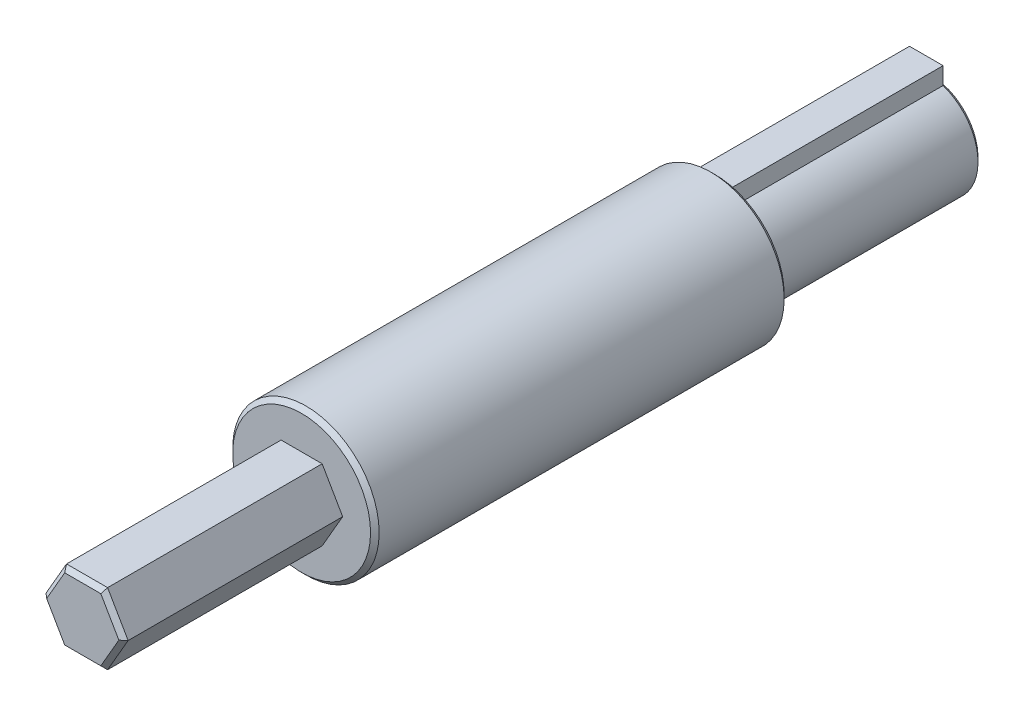
ISO-10303-21;
HEADER;
FILE_DESCRIPTION(('STEP AP214'),'2;1');
FILE_NAME('part.step','',(''),(''),'','','');
FILE_SCHEMA(('AUTOMOTIVE_DESIGN { 1 0 10303 214 1 1 1 1 }'));
ENDSEC;
DATA;
#1=APPLICATION_CONTEXT('core data for automotive mechanical design processes');
#2=APPLICATION_PROTOCOL_DEFINITION('international standard','automotive_design',2000,#1);
#3=PRODUCT_CONTEXT('',#1,'mechanical');
#4=PRODUCT('Part','Part','',(#3));
#5=PRODUCT_RELATED_PRODUCT_CATEGORY('part','',(#4));
#6=PRODUCT_DEFINITION_FORMATION('','',#4);
#7=PRODUCT_DEFINITION_CONTEXT('part definition',#1,'design');
#8=PRODUCT_DEFINITION('design','',#6,#7);
#9=PRODUCT_DEFINITION_SHAPE('','',#8);
#10=(LENGTH_UNIT() NAMED_UNIT(*) SI_UNIT(.MILLI.,.METRE.));
#11=(NAMED_UNIT(*) PLANE_ANGLE_UNIT() SI_UNIT($,.RADIAN.));
#12=(NAMED_UNIT(*) SI_UNIT($,.STERADIAN.) SOLID_ANGLE_UNIT());
#13=UNCERTAINTY_MEASURE_WITH_UNIT(LENGTH_MEASURE(1.E-05),#10,'distance_accuracy_value','');
#14=(GEOMETRIC_REPRESENTATION_CONTEXT(3) GLOBAL_UNCERTAINTY_ASSIGNED_CONTEXT((#13)) GLOBAL_UNIT_ASSIGNED_CONTEXT((#10,
#11,#12)) REPRESENTATION_CONTEXT('',''));
#15=CARTESIAN_POINT('',(0.,0.,0.));
#16=DIRECTION('',(0.,0.,1.));
#17=DIRECTION('',(1.,0.,0.));
#18=AXIS2_PLACEMENT_3D('',#15,#16,#17);
#19=CARTESIAN_POINT('',(0.,0.,0.));
#20=DIRECTION('',(0.,0.,1.));
#21=DIRECTION('',(1.,0.,0.));
#22=AXIS2_PLACEMENT_3D('',#19,#20,#21);
#23=PLANE('',#22);
#24=CARTESIAN_POINT('',(0.,0.,0.));
#25=DIRECTION('',(0.,0.,1.));
#26=DIRECTION('',(1.,0.,0.));
#27=AXIS2_PLACEMENT_3D('',#24,#25,#26);
#28=CIRCLE('',#27,7.99999999999998);
#29=CARTESIAN_POINT('',(7.99999999999998,0.,0.));
#30=VERTEX_POINT('',#29);
#31=EDGE_CURVE('E11',#30,#30,#28,.F.);
#32=ORIENTED_EDGE('',*,*,#31,.T.);
#33=EDGE_LOOP('',(#32));
#34=FACE_BOUND('',#33,.T.);
#35=DIRECTION('',(0.,1.,0.));
#36=VECTOR('',#35,1.);
#37=CARTESIAN_POINT('',(-1.95,7.67428409581332,0.));
#38=LINE('',#37,#36);
#39=CARTESIAN_POINT('',(-1.95,5.67428409581332,0.));
#40=VERTEX_POINT('',#39);
#41=CARTESIAN_POINT('',(-1.95,7.67428409581332,0.));
#42=VERTEX_POINT('',#41);
#43=EDGE_CURVE('E215',#40,#42,#38,.T.);
#44=ORIENTED_EDGE('',*,*,#43,.F.);
#45=CARTESIAN_POINT('',(0.,0.,0.));
#46=DIRECTION('',(0.,0.,1.));
#47=DIRECTION('',(1.,0.,0.));
#48=AXIS2_PLACEMENT_3D('',#45,#46,#47);
#49=CIRCLE('',#48,6.);
#50=CARTESIAN_POINT('',(1.95,5.67428409581332,0.));
#51=VERTEX_POINT('',#50);
#52=EDGE_CURVE('E211',#40,#51,#49,.T.);
#53=ORIENTED_EDGE('',*,*,#52,.T.);
#54=DIRECTION('',(0.,-1.,0.));
#55=VECTOR('',#54,1.);
#56=CARTESIAN_POINT('',(1.95,5.67428409581332,0.));
#57=LINE('',#56,#55);
#58=CARTESIAN_POINT('',(1.95,7.67428409581332,0.));
#59=VERTEX_POINT('',#58);
#60=EDGE_CURVE('E223',#59,#51,#57,.T.);
#61=ORIENTED_EDGE('',*,*,#60,.F.);
#62=DIRECTION('',(1.,0.,0.));
#63=VECTOR('',#62,1.);
#64=CARTESIAN_POINT('',(1.95,7.67428409581332,0.));
#65=LINE('',#64,#63);
#66=EDGE_CURVE('E219',#42,#59,#65,.T.);
#67=ORIENTED_EDGE('',*,*,#66,.F.);
#68=EDGE_LOOP('',(#44,#53,#61,#67));
#69=FACE_BOUND('',#68,.T.);
#70=ADVANCED_FACE('F41',(#34,#69),#23,.F.);
#71=CARTESIAN_POINT('',(0.,0.,48.));
#72=DIRECTION('',(0.,0.,-1.));
#73=DIRECTION('',(-1.,0.,0.));
#74=AXIS2_PLACEMENT_3D('',#71,#72,#73);
#75=CYLINDRICAL_SURFACE('',#74,8.5);
#76=CARTESIAN_POINT('',(0.,0.,47.5));
#77=DIRECTION('',(0.,0.,1.));
#78=DIRECTION('',(1.,0.,0.));
#79=AXIS2_PLACEMENT_3D('',#76,#77,#78);
#80=CIRCLE('',#79,8.5);
#81=CARTESIAN_POINT('',(8.5,0.,47.5));
#82=VERTEX_POINT('',#81);
#83=EDGE_CURVE('E52',#82,#82,#80,.F.);
#84=ORIENTED_EDGE('',*,*,#83,.T.);
#85=EDGE_LOOP('',(#84));
#86=FACE_BOUND('',#85,.T.);
#87=CARTESIAN_POINT('',(0.,0.,0.500000000000035));
#88=DIRECTION('',(0.,0.,1.));
#89=DIRECTION('',(1.,0.,0.));
#90=AXIS2_PLACEMENT_3D('',#87,#88,#89);
#91=CIRCLE('',#90,8.5);
#92=CARTESIAN_POINT('',(8.5,0.,0.500000000000035));
#93=VERTEX_POINT('',#92);
#94=EDGE_CURVE('E304',#93,#93,#91,.T.);
#95=ORIENTED_EDGE('',*,*,#94,.T.);
#96=EDGE_LOOP('',(#95));
#97=FACE_BOUND('',#96,.T.);
#98=ADVANCED_FACE('F409',(#86,#97),#75,.T.);
#99=CARTESIAN_POINT('',(0.,0.,48.));
#100=DIRECTION('',(0.,0.,1.));
#101=DIRECTION('',(1.,0.,0.));
#102=AXIS2_PLACEMENT_3D('',#99,#100,#101);
#103=PLANE('',#102);
#104=CARTESIAN_POINT('',(0.,0.,48.));
#105=DIRECTION('',(0.,0.,1.));
#106=DIRECTION('',(1.,0.,0.));
#107=AXIS2_PLACEMENT_3D('',#104,#105,#106);
#108=CIRCLE('',#107,7.99999999999999);
#109=CARTESIAN_POINT('',(7.99999999999999,0.,48.));
#110=VERTEX_POINT('',#109);
#111=EDGE_CURVE('E300',#110,#110,#108,.T.);
#112=ORIENTED_EDGE('',*,*,#111,.T.);
#113=EDGE_LOOP('',(#112));
#114=FACE_BOUND('',#113,.T.);
#115=DIRECTION('',(0.5,0.866025403784439,0.));
#116=VECTOR('',#115,1.);
#117=CARTESIAN_POINT('',(2.38301323608018,-4.1275,48.));
#118=LINE('',#117,#116);
#119=CARTESIAN_POINT('',(2.38301323608018,-4.1275,48.));
#120=VERTEX_POINT('',#119);
#121=CARTESIAN_POINT('',(4.76602647216036,0.,48.));
#122=VERTEX_POINT('',#121);
#123=EDGE_CURVE('E182',#120,#122,#118,.T.);
#124=ORIENTED_EDGE('',*,*,#123,.F.);
#125=DIRECTION('',(1.,0.,0.));
#126=VECTOR('',#125,1.);
#127=CARTESIAN_POINT('',(-2.38301323608018,-4.1275,48.));
#128=LINE('',#127,#126);
#129=CARTESIAN_POINT('',(-2.38301323608018,-4.1275,48.));
#130=VERTEX_POINT('',#129);
#131=EDGE_CURVE('E194',#130,#120,#128,.T.);
#132=ORIENTED_EDGE('',*,*,#131,.F.);
#133=DIRECTION('',(0.5,-0.866025403784439,0.));
#134=VECTOR('',#133,1.);
#135=CARTESIAN_POINT('',(-4.76602647216036,0.,48.));
#136=LINE('',#135,#134);
#137=CARTESIAN_POINT('',(-4.76602647216036,0.,48.));
#138=VERTEX_POINT('',#137);
#139=EDGE_CURVE('E190',#138,#130,#136,.T.);
#140=ORIENTED_EDGE('',*,*,#139,.F.);
#141=DIRECTION('',(-0.5,-0.866025403784439,0.));
#142=VECTOR('',#141,1.);
#143=CARTESIAN_POINT('',(-2.38301323608018,4.1275,48.));
#144=LINE('',#143,#142);
#145=CARTESIAN_POINT('',(-2.38301323608018,4.1275,48.));
#146=VERTEX_POINT('',#145);
#147=EDGE_CURVE('E176',#146,#138,#144,.T.);
#148=ORIENTED_EDGE('',*,*,#147,.F.);
#149=DIRECTION('',(-1.,0.,0.));
#150=VECTOR('',#149,1.);
#151=CARTESIAN_POINT('',(2.38301323608018,4.1275,48.));
#152=LINE('',#151,#150);
#153=CARTESIAN_POINT('',(2.38301323608018,4.1275,48.));
#154=VERTEX_POINT('',#153);
#155=EDGE_CURVE('E157',#154,#146,#152,.T.);
#156=ORIENTED_EDGE('',*,*,#155,.F.);
#157=DIRECTION('',(-0.5,0.866025403784438,0.));
#158=VECTOR('',#157,1.);
#159=CARTESIAN_POINT('',(4.76602647216036,0.,48.));
#160=LINE('',#159,#158);
#161=EDGE_CURVE('E172',#122,#154,#160,.T.);
#162=ORIENTED_EDGE('',*,*,#161,.F.);
#163=EDGE_LOOP('',(#124,#132,#140,#148,#156,#162));
#164=FACE_BOUND('',#163,.T.);
#165=ADVANCED_FACE('F171',(#114,#164),#103,.T.);
#166=CARTESIAN_POINT('',(0.,0.,25.4));
#167=DIRECTION('',(0.,0.,-1.));
#168=DIRECTION('',(-1.,0.,0.));
#169=AXIS2_PLACEMENT_3D('',#166,#167,#168);
#170=CYLINDRICAL_SURFACE('',#169,6.);
#171=DIRECTION('',(0.,0.,1.));
#172=VECTOR('',#171,1.);
#173=CARTESIAN_POINT('',(-1.95,5.67428409581332,-25.));
#174=LINE('',#173,#172);
#175=CARTESIAN_POINT('',(-1.95,5.67428409581332,-24.5));
#176=VERTEX_POINT('',#175);
#177=EDGE_CURVE('E236',#176,#40,#174,.T.);
#178=ORIENTED_EDGE('',*,*,#177,.F.);
#179=CARTESIAN_POINT('',(0.,0.,-24.5));
#180=DIRECTION('',(0.,0.,-1.));
#181=DIRECTION('',(-1.,0.,0.));
#182=AXIS2_PLACEMENT_3D('',#179,#180,#181);
#183=CIRCLE('',#182,6.);
#184=CARTESIAN_POINT('',(1.95,5.67428409581332,-24.5));
#185=VERTEX_POINT('',#184);
#186=EDGE_CURVE('E297',#176,#185,#183,.F.);
#187=ORIENTED_EDGE('',*,*,#186,.T.);
#188=DIRECTION('',(0.,0.,1.));
#189=VECTOR('',#188,1.);
#190=CARTESIAN_POINT('',(1.95,5.67428409581332,-25.));
#191=LINE('',#190,#189);
#192=EDGE_CURVE('E227',#185,#51,#191,.T.);
#193=ORIENTED_EDGE('',*,*,#192,.T.);
#194=ORIENTED_EDGE('',*,*,#52,.F.);
#195=EDGE_LOOP('',(#178,#187,#193,#194));
#196=FACE_BOUND('',#195,.T.);
#197=ADVANCED_FACE('F392',(#196),#170,.T.);
#198=CARTESIAN_POINT('',(-1.95,7.67428409581332,-25.));
#199=DIRECTION('',(1.,0.,0.));
#200=DIRECTION('',(0.,0.,-1.));
#201=AXIS2_PLACEMENT_3D('',#198,#199,#200);
#202=PLANE('',#201);
#203=DIRECTION('',(0.,0.,1.));
#204=VECTOR('',#203,1.);
#205=CARTESIAN_POINT('',(-1.95,7.67428409581332,-25.));
#206=LINE('',#205,#204);
#207=CARTESIAN_POINT('',(-1.95,7.67428409581332,-24.5));
#208=VERTEX_POINT('',#207);
#209=EDGE_CURVE('E233',#208,#42,#206,.T.);
#210=ORIENTED_EDGE('',*,*,#209,.F.);
#211=DIRECTION('',(0.,-1.,0.));
#212=VECTOR('',#211,1.);
#213=CARTESIAN_POINT('',(-1.95,5.67428409581332,-24.5));
#214=LINE('',#213,#212);
#215=EDGE_CURVE('E60',#208,#176,#214,.T.);
#216=ORIENTED_EDGE('',*,*,#215,.T.);
#217=ORIENTED_EDGE('',*,*,#177,.T.);
#218=ORIENTED_EDGE('',*,*,#43,.T.);
#219=EDGE_LOOP('',(#210,#216,#217,#218));
#220=FACE_BOUND('',#219,.T.);
#221=ADVANCED_FACE('F390',(#220),#202,.F.);
#222=CARTESIAN_POINT('',(1.95,7.67428409581332,-25.));
#223=DIRECTION('',(0.,-1.,0.));
#224=DIRECTION('',(0.,0.,-1.));
#225=AXIS2_PLACEMENT_3D('',#222,#223,#224);
#226=PLANE('',#225);
#227=DIRECTION('',(0.,0.,1.));
#228=VECTOR('',#227,1.);
#229=CARTESIAN_POINT('',(1.95,7.67428409581332,-25.));
#230=LINE('',#229,#228);
#231=CARTESIAN_POINT('',(1.95,7.67428409581332,-24.5));
#232=VERTEX_POINT('',#231);
#233=EDGE_CURVE('E230',#232,#59,#230,.T.);
#234=ORIENTED_EDGE('',*,*,#233,.F.);
#235=DIRECTION('',(-1.,0.,0.));
#236=VECTOR('',#235,1.);
#237=CARTESIAN_POINT('',(-1.95,7.67428409581332,-24.5));
#238=LINE('',#237,#236);
#239=EDGE_CURVE('E68',#232,#208,#238,.T.);
#240=ORIENTED_EDGE('',*,*,#239,.T.);
#241=ORIENTED_EDGE('',*,*,#209,.T.);
#242=ORIENTED_EDGE('',*,*,#66,.T.);
#243=EDGE_LOOP('',(#234,#240,#241,#242));
#244=FACE_BOUND('',#243,.T.);
#245=ADVANCED_FACE('F385',(#244),#226,.F.);
#246=CARTESIAN_POINT('',(1.95,5.67428409581332,-25.));
#247=DIRECTION('',(-1.,0.,0.));
#248=DIRECTION('',(0.,0.,1.));
#249=AXIS2_PLACEMENT_3D('',#246,#247,#248);
#250=PLANE('',#249);
#251=ORIENTED_EDGE('',*,*,#192,.F.);
#252=DIRECTION('',(0.,1.,0.));
#253=VECTOR('',#252,1.);
#254=CARTESIAN_POINT('',(1.95,7.67428409581332,-24.5));
#255=LINE('',#254,#253);
#256=EDGE_CURVE('E289',#185,#232,#255,.T.);
#257=ORIENTED_EDGE('',*,*,#256,.T.);
#258=ORIENTED_EDGE('',*,*,#233,.T.);
#259=ORIENTED_EDGE('',*,*,#60,.T.);
#260=EDGE_LOOP('',(#251,#257,#258,#259));
#261=FACE_BOUND('',#260,.T.);
#262=ADVANCED_FACE('F383',(#261),#250,.F.);
#263=CARTESIAN_POINT('',(0.,0.,-25.));
#264=DIRECTION('',(0.,0.,-1.));
#265=DIRECTION('',(-1.,0.,0.));
#266=AXIS2_PLACEMENT_3D('',#263,#264,#265);
#267=PLANE('',#266);
#268=DIRECTION('',(1.,0.,0.));
#269=VECTOR('',#268,1.);
#270=CARTESIAN_POINT('',(1.95,7.17428409581331,-25.));
#271=LINE('',#270,#269);
#272=CARTESIAN_POINT('',(-1.44999999999999,7.17428409581331,-25.));
#273=VERTEX_POINT('',#272);
#274=CARTESIAN_POINT('',(1.44999999999999,7.17428409581331,-25.));
#275=VERTEX_POINT('',#274);
#276=EDGE_CURVE('E282',#273,#275,#271,.T.);
#277=ORIENTED_EDGE('',*,*,#276,.T.);
#278=DIRECTION('',(0.,-1.,0.));
#279=VECTOR('',#278,1.);
#280=CARTESIAN_POINT('',(1.44999999999999,5.67428409581332,-25.));
#281=LINE('',#280,#279);
#282=CARTESIAN_POINT('',(1.44999999999999,5.30542175514821,-25.));
#283=VERTEX_POINT('',#282);
#284=EDGE_CURVE('E285',#275,#283,#281,.T.);
#285=ORIENTED_EDGE('',*,*,#284,.T.);
#286=CARTESIAN_POINT('',(0.,0.,-25.));
#287=DIRECTION('',(0.,0.,-1.));
#288=DIRECTION('',(-1.,0.,0.));
#289=AXIS2_PLACEMENT_3D('',#286,#287,#288);
#290=CIRCLE('',#289,5.49999999999999);
#291=CARTESIAN_POINT('',(-1.44999999999999,5.30542175514821,-25.));
#292=VERTEX_POINT('',#291);
#293=EDGE_CURVE('E276',#283,#292,#290,.T.);
#294=ORIENTED_EDGE('',*,*,#293,.T.);
#295=DIRECTION('',(0.,1.,0.));
#296=VECTOR('',#295,1.);
#297=CARTESIAN_POINT('',(-1.44999999999999,7.67428409581332,-25.));
#298=LINE('',#297,#296);
#299=EDGE_CURVE('E279',#292,#273,#298,.T.);
#300=ORIENTED_EDGE('',*,*,#299,.T.);
#301=EDGE_LOOP('',(#277,#285,#294,#300));
#302=FACE_BOUND('',#301,.T.);
#303=ADVANCED_FACE('F396',(#302),#267,.T.);
#304=CARTESIAN_POINT('',(2.38301323608018,-4.1275,73.4));
#305=DIRECTION('',(-0.866025403784439,0.5,0.));
#306=DIRECTION('',(-0.5,-0.866025403784439,0.));
#307=AXIS2_PLACEMENT_3D('',#304,#305,#306);
#308=PLANE('',#307);
#309=DIRECTION('',(0.,0.,-1.));
#310=VECTOR('',#309,1.);
#311=CARTESIAN_POINT('',(4.76602647216036,0.,73.4));
#312=LINE('',#311,#310);
#313=CARTESIAN_POINT('',(4.76602647216036,0.,72.9));
#314=VERTEX_POINT('',#313);
#315=EDGE_CURVE('E164',#314,#122,#312,.T.);
#316=ORIENTED_EDGE('',*,*,#315,.F.);
#317=DIRECTION('',(-0.5,-0.866025403784439,0.));
#318=VECTOR('',#317,1.);
#319=CARTESIAN_POINT('',(2.38301323608018,-4.1275,72.9));
#320=LINE('',#319,#318);
#321=CARTESIAN_POINT('',(2.38301323608018,-4.1275,72.9));
#322=VERTEX_POINT('',#321);
#323=EDGE_CURVE('E273',#314,#322,#320,.T.);
#324=ORIENTED_EDGE('',*,*,#323,.T.);
#325=DIRECTION('',(0.,0.,-1.));
#326=VECTOR('',#325,1.);
#327=CARTESIAN_POINT('',(2.38301323608018,-4.1275,73.4));
#328=LINE('',#327,#326);
#329=EDGE_CURVE('E198',#322,#120,#328,.T.);
#330=ORIENTED_EDGE('',*,*,#329,.T.);
#331=ORIENTED_EDGE('',*,*,#123,.T.);
#332=EDGE_LOOP('',(#316,#324,#330,#331));
#333=FACE_BOUND('',#332,.T.);
#334=ADVANCED_FACE('F398',(#333),#308,.F.);
#335=CARTESIAN_POINT('',(4.76602647216036,0.,73.4));
#336=DIRECTION('',(-0.866025403784438,-0.5,0.));
#337=DIRECTION('',(0.5,-0.866025403784439,0.));
#338=AXIS2_PLACEMENT_3D('',#335,#336,#337);
#339=PLANE('',#338);
#340=DIRECTION('',(0.,0.,-1.));
#341=VECTOR('',#340,1.);
#342=CARTESIAN_POINT('',(2.38301323608018,4.1275,73.4));
#343=LINE('',#342,#341);
#344=CARTESIAN_POINT('',(2.38301323608018,4.1275,72.9));
#345=VERTEX_POINT('',#344);
#346=EDGE_CURVE('E153',#345,#154,#343,.T.);
#347=ORIENTED_EDGE('',*,*,#346,.F.);
#348=DIRECTION('',(0.5,-0.866025403784439,0.));
#349=VECTOR('',#348,1.);
#350=CARTESIAN_POINT('',(4.76602647216036,0.,72.9));
#351=LINE('',#350,#349);
#352=EDGE_CURVE('E270',#345,#314,#351,.T.);
#353=ORIENTED_EDGE('',*,*,#352,.T.);
#354=ORIENTED_EDGE('',*,*,#315,.T.);
#355=ORIENTED_EDGE('',*,*,#161,.T.);
#356=EDGE_LOOP('',(#347,#353,#354,#355));
#357=FACE_BOUND('',#356,.T.);
#358=ADVANCED_FACE('F179',(#357),#339,.F.);
#359=CARTESIAN_POINT('',(2.38301323608018,4.1275,73.4));
#360=DIRECTION('',(0.,-1.,0.));
#361=DIRECTION('',(1.,0.,0.));
#362=AXIS2_PLACEMENT_3D('',#359,#360,#361);
#363=PLANE('',#362);
#364=DIRECTION('',(0.,0.,-1.));
#365=VECTOR('',#364,1.);
#366=CARTESIAN_POINT('',(-2.38301323608018,4.1275,73.4));
#367=LINE('',#366,#365);
#368=CARTESIAN_POINT('',(-2.38301323608018,4.1275,72.9));
#369=VERTEX_POINT('',#368);
#370=EDGE_CURVE('E165',#369,#146,#367,.T.);
#371=ORIENTED_EDGE('',*,*,#370,.F.);
#372=DIRECTION('',(1.,0.,0.));
#373=VECTOR('',#372,1.);
#374=CARTESIAN_POINT('',(2.38301323608018,4.1275,72.9));
#375=LINE('',#374,#373);
#376=EDGE_CURVE('E159',#369,#345,#375,.T.);
#377=ORIENTED_EDGE('',*,*,#376,.T.);
#378=ORIENTED_EDGE('',*,*,#346,.T.);
#379=ORIENTED_EDGE('',*,*,#155,.T.);
#380=EDGE_LOOP('',(#371,#377,#378,#379));
#381=FACE_BOUND('',#380,.T.);
#382=ADVANCED_FACE('F156',(#381),#363,.F.);
#383=CARTESIAN_POINT('',(-2.38301323608018,4.1275,73.4));
#384=DIRECTION('',(0.866025403784439,-0.5,0.));
#385=DIRECTION('',(0.5,0.866025403784439,0.));
#386=AXIS2_PLACEMENT_3D('',#383,#384,#385);
#387=PLANE('',#386);
#388=DIRECTION('',(0.,0.,-1.));
#389=VECTOR('',#388,1.);
#390=CARTESIAN_POINT('',(-4.76602647216036,0.,73.4));
#391=LINE('',#390,#389);
#392=CARTESIAN_POINT('',(-4.76602647216036,0.,72.9));
#393=VERTEX_POINT('',#392);
#394=EDGE_CURVE('E204',#393,#138,#391,.T.);
#395=ORIENTED_EDGE('',*,*,#394,.F.);
#396=DIRECTION('',(0.5,0.866025403784439,0.));
#397=VECTOR('',#396,1.);
#398=CARTESIAN_POINT('',(-2.38301323608018,4.1275,72.9));
#399=LINE('',#398,#397);
#400=EDGE_CURVE('E265',#393,#369,#399,.T.);
#401=ORIENTED_EDGE('',*,*,#400,.T.);
#402=ORIENTED_EDGE('',*,*,#370,.T.);
#403=ORIENTED_EDGE('',*,*,#147,.T.);
#404=EDGE_LOOP('',(#395,#401,#402,#403));
#405=FACE_BOUND('',#404,.T.);
#406=ADVANCED_FACE('F424',(#405),#387,.F.);
#407=CARTESIAN_POINT('',(-4.76602647216036,0.,73.4));
#408=DIRECTION('',(0.866025403784439,0.5,0.));
#409=DIRECTION('',(-0.5,0.866025403784439,0.));
#410=AXIS2_PLACEMENT_3D('',#407,#408,#409);
#411=PLANE('',#410);
#412=DIRECTION('',(0.,0.,-1.));
#413=VECTOR('',#412,1.);
#414=CARTESIAN_POINT('',(-2.38301323608018,-4.1275,73.4));
#415=LINE('',#414,#413);
#416=CARTESIAN_POINT('',(-2.38301323608018,-4.1275,72.9));
#417=VERTEX_POINT('',#416);
#418=EDGE_CURVE('E201',#417,#130,#415,.T.);
#419=ORIENTED_EDGE('',*,*,#418,.F.);
#420=DIRECTION('',(-0.5,0.866025403784439,0.));
#421=VECTOR('',#420,1.);
#422=CARTESIAN_POINT('',(-4.76602647216036,0.,72.9));
#423=LINE('',#422,#421);
#424=EDGE_CURVE('E262',#417,#393,#423,.T.);
#425=ORIENTED_EDGE('',*,*,#424,.T.);
#426=ORIENTED_EDGE('',*,*,#394,.T.);
#427=ORIENTED_EDGE('',*,*,#139,.T.);
#428=EDGE_LOOP('',(#419,#425,#426,#427));
#429=FACE_BOUND('',#428,.T.);
#430=ADVANCED_FACE('F427',(#429),#411,.F.);
#431=CARTESIAN_POINT('',(-2.38301323608018,-4.1275,73.4));
#432=DIRECTION('',(0.,1.,0.));
#433=DIRECTION('',(-1.,0.,0.));
#434=AXIS2_PLACEMENT_3D('',#431,#432,#433);
#435=PLANE('',#434);
#436=ORIENTED_EDGE('',*,*,#329,.F.);
#437=DIRECTION('',(-1.,0.,0.));
#438=VECTOR('',#437,1.);
#439=CARTESIAN_POINT('',(-2.38301323608018,-4.1275,72.9));
#440=LINE('',#439,#438);
#441=EDGE_CURVE('E258',#322,#417,#440,.T.);
#442=ORIENTED_EDGE('',*,*,#441,.T.);
#443=ORIENTED_EDGE('',*,*,#418,.T.);
#444=ORIENTED_EDGE('',*,*,#131,.T.);
#445=EDGE_LOOP('',(#436,#442,#443,#444));
#446=FACE_BOUND('',#445,.T.);
#447=ADVANCED_FACE('F431',(#446),#435,.F.);
#448=CARTESIAN_POINT('',(0.,0.,73.4));
#449=DIRECTION('',(0.,0.,1.));
#450=DIRECTION('',(1.,0.,0.));
#451=AXIS2_PLACEMENT_3D('',#448,#449,#450);
#452=PLANE('',#451);
#453=DIRECTION('',(0.5,-0.866025403784439,0.));
#454=VECTOR('',#453,1.);
#455=CARTESIAN_POINT('',(-1.95000053418796,-3.8775,73.4));
#456=LINE('',#455,#454);
#457=CARTESIAN_POINT('',(-4.18867620297074,0.,73.4));
#458=VERTEX_POINT('',#457);
#459=CARTESIAN_POINT('',(-2.09433810148537,-3.6275,73.4));
#460=VERTEX_POINT('',#459);
#461=EDGE_CURVE('E251',#458,#460,#456,.T.);
#462=ORIENTED_EDGE('',*,*,#461,.T.);
#463=DIRECTION('',(1.,0.,0.));
#464=VECTOR('',#463,1.);
#465=CARTESIAN_POINT('',(2.38301323608018,-3.6275,73.4));
#466=LINE('',#465,#464);
#467=CARTESIAN_POINT('',(2.09433810148537,-3.6275,73.4));
#468=VERTEX_POINT('',#467);
#469=EDGE_CURVE('E254',#460,#468,#466,.T.);
#470=ORIENTED_EDGE('',*,*,#469,.T.);
#471=DIRECTION('',(0.5,0.866025403784439,0.));
#472=VECTOR('',#471,1.);
#473=CARTESIAN_POINT('',(4.33301377026815,0.249999999999999,73.4));
#474=LINE('',#473,#472);
#475=CARTESIAN_POINT('',(4.18867620297074,0.,73.4));
#476=VERTEX_POINT('',#475);
#477=EDGE_CURVE('E239',#468,#476,#474,.T.);
#478=ORIENTED_EDGE('',*,*,#477,.T.);
#479=DIRECTION('',(-0.5,0.866025403784439,0.));
#480=VECTOR('',#479,1.);
#481=CARTESIAN_POINT('',(1.95000053418796,3.8775,73.4));
#482=LINE('',#481,#480);
#483=CARTESIAN_POINT('',(2.09433810148537,3.6275,73.4));
#484=VERTEX_POINT('',#483);
#485=EDGE_CURVE('E242',#476,#484,#482,.T.);
#486=ORIENTED_EDGE('',*,*,#485,.T.);
#487=DIRECTION('',(-1.,0.,0.));
#488=VECTOR('',#487,1.);
#489=CARTESIAN_POINT('',(-2.38301323608018,3.6275,73.4));
#490=LINE('',#489,#488);
#491=CARTESIAN_POINT('',(-2.09433810148537,3.6275,73.4));
#492=VERTEX_POINT('',#491);
#493=EDGE_CURVE('E245',#484,#492,#490,.T.);
#494=ORIENTED_EDGE('',*,*,#493,.T.);
#495=DIRECTION('',(-0.5,-0.866025403784439,0.));
#496=VECTOR('',#495,1.);
#497=CARTESIAN_POINT('',(-4.33301377026814,-0.249999999999997,73.4));
#498=LINE('',#497,#496);
#499=EDGE_CURVE('E248',#492,#458,#498,.T.);
#500=ORIENTED_EDGE('',*,*,#499,.T.);
#501=EDGE_LOOP('',(#462,#470,#478,#486,#494,#500));
#502=FACE_BOUND('',#501,.T.);
#503=ADVANCED_FACE('F435',(#502),#452,.T.);
#504=CARTESIAN_POINT('',(0.,3.6275,73.4));
#505=DIRECTION('',(0.,0.707106781186551,0.707106781186544));
#506=DIRECTION('',(1.,0.,0.));
#507=AXIS2_PLACEMENT_3D('',#504,#505,#506);
#508=PLANE('',#507);
#509=DIRECTION('',(-0.377964473009227,-0.654653670707974,0.65465367070798));
#510=VECTOR('',#509,1.);
#511=CARTESIAN_POINT('',(1.79514694413032,3.10928571428572,73.9182142857143));
#512=LINE('',#511,#510);
#513=EDGE_CURVE('E325',#345,#484,#512,.T.);
#514=ORIENTED_EDGE('',*,*,#513,.F.);
#515=ORIENTED_EDGE('',*,*,#376,.F.);
#516=DIRECTION('',(0.377964473009226,-0.654653670707975,0.65465367070798));
#517=VECTOR('',#516,1.);
#518=CARTESIAN_POINT('',(-1.79514694413032,3.10928571428572,73.9182142857143));
#519=LINE('',#518,#517);
#520=EDGE_CURVE('E185',#492,#369,#519,.F.);
#521=ORIENTED_EDGE('',*,*,#520,.F.);
#522=ORIENTED_EDGE('',*,*,#493,.F.);
#523=EDGE_LOOP('',(#514,#515,#521,#522));
#524=FACE_BOUND('',#523,.T.);
#525=ADVANCED_FACE('F438',(#524),#508,.T.);
#526=CARTESIAN_POINT('',(-3.14150715222805,1.81375,73.4));
#527=DIRECTION('',(-0.612372435695797,0.353553390593275,0.707106781186545));
#528=DIRECTION('',(0.5,0.866025403784439,0.));
#529=AXIS2_PLACEMENT_3D('',#526,#527,#528);
#530=PLANE('',#529);
#531=ORIENTED_EDGE('',*,*,#520,.T.);
#532=ORIENTED_EDGE('',*,*,#400,.F.);
#533=DIRECTION('',(0.755928946018452,0.,0.65465367070798));
#534=VECTOR('',#533,1.);
#535=CARTESIAN_POINT('',(-3.59029388826064,0.,73.9182142857143));
#536=LINE('',#535,#534);
#537=EDGE_CURVE('E321',#458,#393,#536,.F.);
#538=ORIENTED_EDGE('',*,*,#537,.F.);
#539=ORIENTED_EDGE('',*,*,#499,.F.);
#540=EDGE_LOOP('',(#531,#532,#538,#539));
#541=FACE_BOUND('',#540,.T.);
#542=ADVANCED_FACE('F443',(#541),#530,.T.);
#543=CARTESIAN_POINT('',(3.14150715222805,1.81375,73.4));
#544=DIRECTION('',(0.612372435695797,0.353553390593275,0.707106781186545));
#545=DIRECTION('',(0.5,-0.866025403784439,0.));
#546=AXIS2_PLACEMENT_3D('',#543,#544,#545);
#547=PLANE('',#546);
#548=ORIENTED_EDGE('',*,*,#513,.T.);
#549=ORIENTED_EDGE('',*,*,#485,.F.);
#550=DIRECTION('',(-0.755928946018452,0.,0.65465367070798));
#551=VECTOR('',#550,1.);
#552=CARTESIAN_POINT('',(3.59029388826064,0.,73.9182142857143));
#553=LINE('',#552,#551);
#554=EDGE_CURVE('E317',#314,#476,#553,.T.);
#555=ORIENTED_EDGE('',*,*,#554,.F.);
#556=ORIENTED_EDGE('',*,*,#352,.F.);
#557=EDGE_LOOP('',(#548,#549,#555,#556));
#558=FACE_BOUND('',#557,.T.);
#559=ADVANCED_FACE('F465',(#558),#547,.T.);
#560=CARTESIAN_POINT('',(-3.14150715222805,-1.81375,73.4));
#561=DIRECTION('',(-0.612372435695797,-0.353553390593275,0.707106781186545));
#562=DIRECTION('',(-0.5,0.866025403784439,0.));
#563=AXIS2_PLACEMENT_3D('',#560,#561,#562);
#564=PLANE('',#563);
#565=ORIENTED_EDGE('',*,*,#537,.T.);
#566=ORIENTED_EDGE('',*,*,#424,.F.);
#567=DIRECTION('',(0.377964473009226,0.654653670707975,0.65465367070798));
#568=VECTOR('',#567,1.);
#569=CARTESIAN_POINT('',(-1.79514694413032,-3.10928571428572,73.9182142857143));
#570=LINE('',#569,#568);
#571=EDGE_CURVE('E314',#460,#417,#570,.F.);
#572=ORIENTED_EDGE('',*,*,#571,.F.);
#573=ORIENTED_EDGE('',*,*,#461,.F.);
#574=EDGE_LOOP('',(#565,#566,#572,#573));
#575=FACE_BOUND('',#574,.T.);
#576=ADVANCED_FACE('F452',(#575),#564,.T.);
#577=CARTESIAN_POINT('',(3.14150715222805,-1.81375,73.4));
#578=DIRECTION('',(0.612372435695797,-0.353553390593275,0.707106781186544));
#579=DIRECTION('',(-0.5,-0.866025403784439,0.));
#580=AXIS2_PLACEMENT_3D('',#577,#578,#579);
#581=PLANE('',#580);
#582=ORIENTED_EDGE('',*,*,#554,.T.);
#583=ORIENTED_EDGE('',*,*,#477,.F.);
#584=DIRECTION('',(0.377964473009226,-0.654653670707975,-0.65465367070798));
#585=VECTOR('',#584,1.);
#586=CARTESIAN_POINT('',(1.79514694413032,-3.10928571428572,73.9182142857143));
#587=LINE('',#586,#585);
#588=EDGE_CURVE('E311',#322,#468,#587,.F.);
#589=ORIENTED_EDGE('',*,*,#588,.F.);
#590=ORIENTED_EDGE('',*,*,#323,.F.);
#591=EDGE_LOOP('',(#582,#583,#589,#590));
#592=FACE_BOUND('',#591,.T.);
#593=ADVANCED_FACE('F460',(#592),#581,.T.);
#594=CARTESIAN_POINT('',(0.,-3.6275,73.4));
#595=DIRECTION('',(0.,-0.707106781186551,0.707106781186544));
#596=DIRECTION('',(-1.,0.,0.));
#597=AXIS2_PLACEMENT_3D('',#594,#595,#596);
#598=PLANE('',#597);
#599=ORIENTED_EDGE('',*,*,#571,.T.);
#600=ORIENTED_EDGE('',*,*,#441,.F.);
#601=ORIENTED_EDGE('',*,*,#588,.T.);
#602=ORIENTED_EDGE('',*,*,#469,.F.);
#603=EDGE_LOOP('',(#599,#600,#601,#602));
#604=FACE_BOUND('',#603,.T.);
#605=ADVANCED_FACE('F455',(#604),#598,.T.);
#606=CARTESIAN_POINT('',(-1.44999999999999,0.,-25.));
#607=DIRECTION('',(-0.707106781186543,0.,-0.707106781186552));
#608=DIRECTION('',(0.,-1.,0.));
#609=AXIS2_PLACEMENT_3D('',#606,#607,#608);
#610=PLANE('',#609);
#611=CARTESIAN_POINT('',(-1.95,5.67428409581332,-24.5));
#612=CARTESIAN_POINT('',(-1.90804327183286,5.64433744400639,-24.5419567281671));
#613=CARTESIAN_POINT('',(-1.86615379292389,5.61420209570535,-24.5838462070761));
#614=CARTESIAN_POINT('',(-1.78251877585006,5.55354143712451,-24.6674812241499));
#615=CARTESIAN_POINT('',(-1.74077323095154,5.52301614541058,-24.7092267690485));
#616=CARTESIAN_POINT('',(-1.6574313311616,5.46156003695683,-24.7925686688384));
#617=CARTESIAN_POINT('',(-1.61583497702691,5.43062921816376,-24.8341650229731));
#618=CARTESIAN_POINT('',(-1.53279805579337,5.36834550782799,-24.9172019442066));
#619=CARTESIAN_POINT('',(-1.49135749617878,5.33699259633151,-24.9586425038212));
#620=CARTESIAN_POINT('',(-1.44999999999993,5.30542175514838,-25.0000000000001));
#621=B_SPLINE_CURVE_WITH_KNOTS('',3,(#611,#612,#613,#614,#615,#616,#617,#618,#619,#620),
.UNSPECIFIED.,.F.,.F.,(4,2,2,2,4),(0.,0.199393472285531,0.398777486226483,0.598162510065852,
0.797556992854161),.UNSPECIFIED.);
#622=EDGE_CURVE('E360',#176,#292,#621,.T.);
#623=ORIENTED_EDGE('',*,*,#622,.F.);
#624=ORIENTED_EDGE('',*,*,#215,.F.);
#625=DIRECTION('',(0.577350269189628,-0.577350269189628,-0.577350269189621));
#626=VECTOR('',#625,1.);
#627=CARTESIAN_POINT('',(0.9414280319378,4.78285606387552,-27.3914280319378));
#628=LINE('',#627,#626);
#629=EDGE_CURVE('E46',#273,#208,#628,.F.);
#630=ORIENTED_EDGE('',*,*,#629,.F.);
#631=ORIENTED_EDGE('',*,*,#299,.F.);
#632=EDGE_LOOP('',(#623,#624,#630,#631));
#633=FACE_BOUND('',#632,.T.);
#634=ADVANCED_FACE('F356',(#633),#610,.T.);
#635=CARTESIAN_POINT('',(0.,7.17428409581331,-25.));
#636=DIRECTION('',(0.,0.707106781186543,-0.707106781186552));
#637=DIRECTION('',(-1.,0.,0.));
#638=AXIS2_PLACEMENT_3D('',#635,#636,#637);
#639=PLANE('',#638);
#640=ORIENTED_EDGE('',*,*,#629,.T.);
#641=ORIENTED_EDGE('',*,*,#239,.F.);
#642=DIRECTION('',(-0.577350269189628,-0.577350269189628,-0.577350269189621));
#643=VECTOR('',#642,1.);
#644=CARTESIAN_POINT('',(0.966666666666656,6.69095076247998,-25.4833333333333));
#645=LINE('',#644,#643);
#646=EDGE_CURVE('E341',#275,#232,#645,.F.);
#647=ORIENTED_EDGE('',*,*,#646,.F.);
#648=ORIENTED_EDGE('',*,*,#276,.F.);
#649=EDGE_LOOP('',(#640,#641,#647,#648));
#650=FACE_BOUND('',#649,.T.);
#651=ADVANCED_FACE('F354',(#650),#639,.T.);
#652=CARTESIAN_POINT('',(0.,0.,-25.));
#653=DIRECTION('',(0.,0.,1.));
#654=DIRECTION('',(1.,0.,0.));
#655=AXIS2_PLACEMENT_3D('',#652,#653,#654);
#656=CONICAL_SURFACE('',#655,5.49999999999999,0.785398163397458);
#657=ORIENTED_EDGE('',*,*,#622,.T.);
#658=ORIENTED_EDGE('',*,*,#293,.F.);
#659=CARTESIAN_POINT('',(1.44999999999999,5.30542175514822,-25.));
#660=CARTESIAN_POINT('',(1.4913574961788,5.33699259633145,-24.9586425038212));
#661=CARTESIAN_POINT('',(1.53279805579337,5.36834550782797,-24.9172019442066));
#662=CARTESIAN_POINT('',(1.61583497702689,5.43062921816378,-24.8341650229731));
#663=CARTESIAN_POINT('',(1.65743133116159,5.46156003695684,-24.7925686688384));
#664=CARTESIAN_POINT('',(1.74077323095154,5.52301614541057,-24.7092267690485));
#665=CARTESIAN_POINT('',(1.78251877585006,5.55354143712447,-24.6674812241499));
#666=CARTESIAN_POINT('',(1.86615379292387,5.61420209570539,-24.5838462070761));
#667=CARTESIAN_POINT('',(1.90804327183281,5.64433744400652,-24.5419567281672));
#668=CARTESIAN_POINT('',(1.94999999999987,5.67428409581366,-24.5000000000001));
#669=B_SPLINE_CURVE_WITH_KNOTS('',3,(#659,#660,#661,#662,#663,#664,#665,#666,#667,#668),
.UNSPECIFIED.,.F.,.F.,(4,2,2,2,4),(0.,0.199394482788309,0.398779506627678,0.598163520568629,
0.797556992854158),.UNSPECIFIED.);
#670=EDGE_CURVE('E332',#185,#283,#669,.F.);
#671=ORIENTED_EDGE('',*,*,#670,.F.);
#672=ORIENTED_EDGE('',*,*,#186,.F.);
#673=EDGE_LOOP('',(#657,#658,#671,#672));
#674=FACE_BOUND('',#673,.T.);
#675=ADVANCED_FACE('F347',(#674),#656,.T.);
#676=CARTESIAN_POINT('',(1.44999999999999,0.,-25.));
#677=DIRECTION('',(0.707106781186543,0.,-0.707106781186552));
#678=DIRECTION('',(0.,1.,0.));
#679=AXIS2_PLACEMENT_3D('',#676,#677,#678);
#680=PLANE('',#679);
#681=ORIENTED_EDGE('',*,*,#646,.T.);
#682=ORIENTED_EDGE('',*,*,#256,.F.);
#683=ORIENTED_EDGE('',*,*,#670,.T.);
#684=ORIENTED_EDGE('',*,*,#284,.F.);
#685=EDGE_LOOP('',(#681,#682,#683,#684));
#686=FACE_BOUND('',#685,.T.);
#687=ADVANCED_FACE('F343',(#686),#680,.T.);
#688=CARTESIAN_POINT('',(0.,0.,48.));
#689=DIRECTION('',(0.,0.,-1.));
#690=DIRECTION('',(-1.,0.,0.));
#691=AXIS2_PLACEMENT_3D('',#688,#689,#690);
#692=CONICAL_SURFACE('',#691,7.99999999999999,0.785398163397448);
#693=ORIENTED_EDGE('',*,*,#83,.F.);
#694=EDGE_LOOP('',(#693));
#695=FACE_BOUND('',#694,.T.);
#696=ORIENTED_EDGE('',*,*,#111,.F.);
#697=EDGE_LOOP('',(#696));
#698=FACE_BOUND('',#697,.T.);
#699=ADVANCED_FACE('F628',(#695,#698),#692,.T.);
#700=CARTESIAN_POINT('',(0.,0.,0.500000000000035));
#701=DIRECTION('',(0.,0.,1.));
#702=DIRECTION('',(1.,0.,0.));
#703=AXIS2_PLACEMENT_3D('',#700,#701,#702);
#704=CONICAL_SURFACE('',#703,8.5,0.785398163397434);
#705=ORIENTED_EDGE('',*,*,#31,.F.);
#706=EDGE_LOOP('',(#705));
#707=FACE_BOUND('',#706,.T.);
#708=ORIENTED_EDGE('',*,*,#94,.F.);
#709=EDGE_LOOP('',(#708));
#710=FACE_BOUND('',#709,.T.);
#711=ADVANCED_FACE('F44',(#707,#710),#704,.T.);
#712=CLOSED_SHELL('',(#70,#98,#165,#197,#221,#245,#262,#303,#334,#358,#382,#406,#430,#447,#503,
#525,#542,#559,#576,#593,#605,#634,#651,#675,#687,#699,#711));
#713=MANIFOLD_SOLID_BREP('B2',#712);
#714=ADVANCED_BREP_SHAPE_REPRESENTATION('',(#18,#713),#14);
#715=SHAPE_DEFINITION_REPRESENTATION(#9,#714);
ENDSEC;
END-ISO-10303-21;
